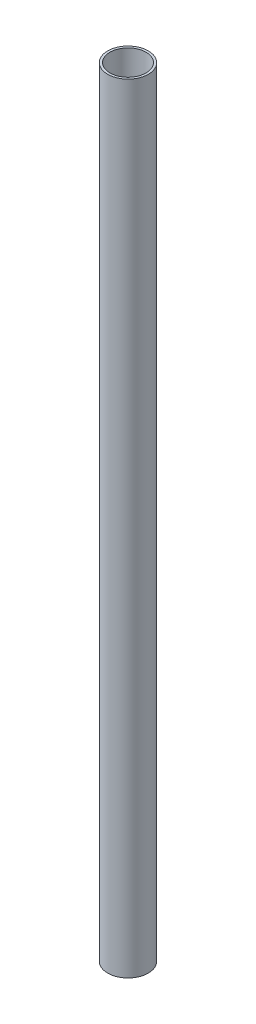
ISO-10303-21;
HEADER;
FILE_DESCRIPTION(('STEP AP214'),'2;1');
FILE_NAME('part.step','',(''),(''),'','','');
FILE_SCHEMA(('AUTOMOTIVE_DESIGN { 1 0 10303 214 1 1 1 1 }'));
ENDSEC;
DATA;
#1=APPLICATION_CONTEXT('core data for automotive mechanical design processes');
#2=APPLICATION_PROTOCOL_DEFINITION('international standard','automotive_design',2000,#1);
#3=PRODUCT_CONTEXT('',#1,'mechanical');
#4=PRODUCT('Part','Part','',(#3));
#5=PRODUCT_RELATED_PRODUCT_CATEGORY('part','',(#4));
#6=PRODUCT_DEFINITION_FORMATION('','',#4);
#7=PRODUCT_DEFINITION_CONTEXT('part definition',#1,'design');
#8=PRODUCT_DEFINITION('design','',#6,#7);
#9=PRODUCT_DEFINITION_SHAPE('','',#8);
#10=(LENGTH_UNIT() NAMED_UNIT(*) SI_UNIT(.MILLI.,.METRE.));
#11=(NAMED_UNIT(*) PLANE_ANGLE_UNIT() SI_UNIT($,.RADIAN.));
#12=(NAMED_UNIT(*) SI_UNIT($,.STERADIAN.) SOLID_ANGLE_UNIT());
#13=UNCERTAINTY_MEASURE_WITH_UNIT(LENGTH_MEASURE(1.E-05),#10,'distance_accuracy_value','');
#14=(GEOMETRIC_REPRESENTATION_CONTEXT(3) GLOBAL_UNCERTAINTY_ASSIGNED_CONTEXT((#13)) GLOBAL_UNIT_ASSIGNED_CONTEXT((#10,
#11,#12)) REPRESENTATION_CONTEXT('',''));
#15=CARTESIAN_POINT('',(0.,0.,0.));
#16=DIRECTION('',(0.,0.,1.));
#17=DIRECTION('',(1.,0.,0.));
#18=AXIS2_PLACEMENT_3D('',#15,#16,#17);
#19=CARTESIAN_POINT('',(13.6326591615901,304.41,-6.07942908557396));
#20=DIRECTION('',(0.,1.,0.));
#21=DIRECTION('',(0.,0.,1.));
#22=AXIS2_PLACEMENT_3D('',#19,#20,#21);
#23=PLANE('',#22);
#24=CARTESIAN_POINT('',(13.6326591615901,304.41,-6.07942908557396));
#25=DIRECTION('',(0.,1.,0.));
#26=DIRECTION('',(0.,0.,1.));
#27=AXIS2_PLACEMENT_3D('',#24,#25,#26);
#28=CIRCLE('',#27,7.9375);
#29=CARTESIAN_POINT('',(13.6326591615901,304.41,1.85807091442604));
#30=VERTEX_POINT('',#29);
#31=EDGE_CURVE('E10',#30,#30,#28,.T.);
#32=ORIENTED_EDGE('',*,*,#31,.T.);
#33=EDGE_LOOP('',(#32));
#34=FACE_BOUND('',#33,.T.);
#35=CARTESIAN_POINT('',(13.6326591615901,304.41,-6.07942908557396));
#36=DIRECTION('',(0.,1.,0.));
#37=DIRECTION('',(0.,0.,1.));
#38=AXIS2_PLACEMENT_3D('',#35,#36,#37);
#39=CIRCLE('',#38,7.0485);
#40=CARTESIAN_POINT('',(13.6326591615901,304.41,0.969070914426036));
#41=VERTEX_POINT('',#40);
#42=EDGE_CURVE('E42',#41,#41,#39,.T.);
#43=ORIENTED_EDGE('',*,*,#42,.F.);
#44=EDGE_LOOP('',(#43));
#45=FACE_BOUND('',#44,.T.);
#46=ADVANCED_FACE('F31',(#34,#45),#23,.T.);
#47=CARTESIAN_POINT('',(13.6326591615901,0.,-6.07942908557396));
#48=DIRECTION('',(0.,1.,0.));
#49=DIRECTION('',(0.,0.,1.));
#50=AXIS2_PLACEMENT_3D('',#47,#48,#49);
#51=PLANE('',#50);
#52=CARTESIAN_POINT('',(13.6326591615901,0.,-6.07942908557396));
#53=DIRECTION('',(0.,1.,0.));
#54=DIRECTION('',(0.,0.,1.));
#55=AXIS2_PLACEMENT_3D('',#52,#53,#54);
#56=CIRCLE('',#55,7.9375);
#57=CARTESIAN_POINT('',(13.6326591615901,0.,1.85807091442604));
#58=VERTEX_POINT('',#57);
#59=EDGE_CURVE('E35',#58,#58,#56,.T.);
#60=ORIENTED_EDGE('',*,*,#59,.F.);
#61=EDGE_LOOP('',(#60));
#62=FACE_BOUND('',#61,.T.);
#63=CARTESIAN_POINT('',(13.6326591615901,0.,-6.07942908557396));
#64=DIRECTION('',(0.,1.,0.));
#65=DIRECTION('',(0.,0.,1.));
#66=AXIS2_PLACEMENT_3D('',#63,#64,#65);
#67=CIRCLE('',#66,7.0485);
#68=CARTESIAN_POINT('',(13.6326591615901,0.,0.969070914426036));
#69=VERTEX_POINT('',#68);
#70=EDGE_CURVE('E44',#69,#69,#67,.T.);
#71=ORIENTED_EDGE('',*,*,#70,.T.);
#72=EDGE_LOOP('',(#71));
#73=FACE_BOUND('',#72,.T.);
#74=ADVANCED_FACE('F54',(#62,#73),#51,.F.);
#75=CARTESIAN_POINT('',(13.6326591615901,304.41,-6.07942908557396));
#76=DIRECTION('',(0.,-1.,0.));
#77=DIRECTION('',(0.,0.,-1.));
#78=AXIS2_PLACEMENT_3D('',#75,#76,#77);
#79=CYLINDRICAL_SURFACE('',#78,7.9375);
#80=ORIENTED_EDGE('',*,*,#31,.F.);
#81=EDGE_LOOP('',(#80));
#82=FACE_BOUND('',#81,.T.);
#83=ORIENTED_EDGE('',*,*,#59,.T.);
#84=EDGE_LOOP('',(#83));
#85=FACE_BOUND('',#84,.T.);
#86=ADVANCED_FACE('F33',(#82,#85),#79,.T.);
#87=CARTESIAN_POINT('',(13.6326591615901,304.41,-6.07942908557396));
#88=DIRECTION('',(0.,-1.,0.));
#89=DIRECTION('',(0.,0.,-1.));
#90=AXIS2_PLACEMENT_3D('',#87,#88,#89);
#91=CYLINDRICAL_SURFACE('',#90,7.0485);
#92=ORIENTED_EDGE('',*,*,#42,.T.);
#93=EDGE_LOOP('',(#92));
#94=FACE_BOUND('',#93,.T.);
#95=ORIENTED_EDGE('',*,*,#70,.F.);
#96=EDGE_LOOP('',(#95));
#97=FACE_BOUND('',#96,.T.);
#98=ADVANCED_FACE('F50',(#94,#97),#91,.F.);
#99=CLOSED_SHELL('',(#46,#74,#86,#98));
#100=MANIFOLD_SOLID_BREP('B2',#99);
#101=ADVANCED_BREP_SHAPE_REPRESENTATION('',(#18,#100),#14);
#102=SHAPE_DEFINITION_REPRESENTATION(#9,#101);
ENDSEC;
END-ISO-10303-21;
